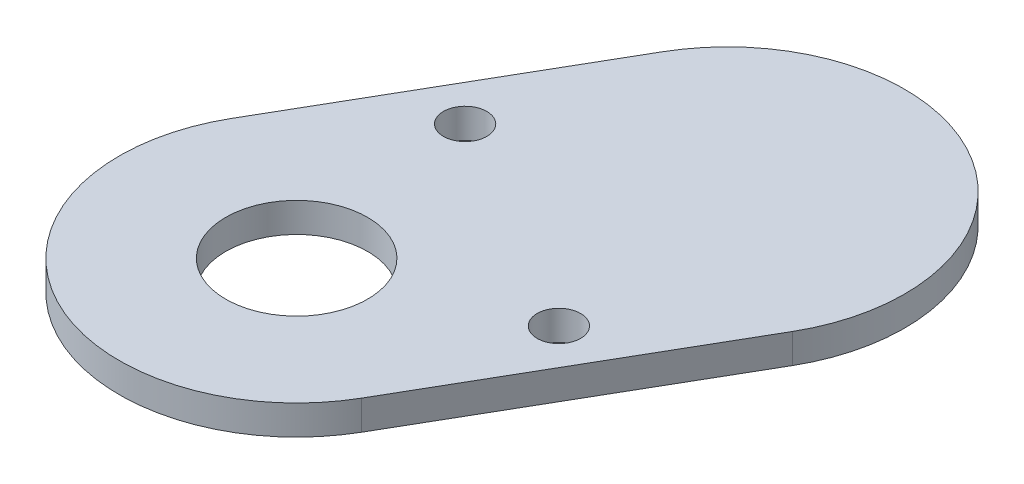
ISO-10303-21;
HEADER;
FILE_DESCRIPTION(('STEP AP214'),'2;1');
FILE_NAME('part.step','',(''),(''),'','','');
FILE_SCHEMA(('AUTOMOTIVE_DESIGN { 1 0 10303 214 1 1 1 1 }'));
ENDSEC;
DATA;
#1=APPLICATION_CONTEXT('core data for automotive mechanical design processes');
#2=APPLICATION_PROTOCOL_DEFINITION('international standard','automotive_design',2000,#1);
#3=PRODUCT_CONTEXT('',#1,'mechanical');
#4=PRODUCT('Part','Part','',(#3));
#5=PRODUCT_RELATED_PRODUCT_CATEGORY('part','',(#4));
#6=PRODUCT_DEFINITION_FORMATION('','',#4);
#7=PRODUCT_DEFINITION_CONTEXT('part definition',#1,'design');
#8=PRODUCT_DEFINITION('design','',#6,#7);
#9=PRODUCT_DEFINITION_SHAPE('','',#8);
#10=(LENGTH_UNIT() NAMED_UNIT(*) SI_UNIT(.MILLI.,.METRE.));
#11=(NAMED_UNIT(*) PLANE_ANGLE_UNIT() SI_UNIT($,.RADIAN.));
#12=(NAMED_UNIT(*) SI_UNIT($,.STERADIAN.) SOLID_ANGLE_UNIT());
#13=UNCERTAINTY_MEASURE_WITH_UNIT(LENGTH_MEASURE(1.E-05),#10,'distance_accuracy_value','');
#14=(GEOMETRIC_REPRESENTATION_CONTEXT(3) GLOBAL_UNCERTAINTY_ASSIGNED_CONTEXT((#13)) GLOBAL_UNIT_ASSIGNED_CONTEXT((#10,
#11,#12)) REPRESENTATION_CONTEXT('',''));
#15=CARTESIAN_POINT('',(0.,0.,0.));
#16=DIRECTION('',(0.,0.,1.));
#17=DIRECTION('',(1.,0.,0.));
#18=AXIS2_PLACEMENT_3D('',#15,#16,#17);
#19=CARTESIAN_POINT('',(-33.3708348754,54.1,-3.678203230276));
#20=DIRECTION('',(0.,1.,0.));
#21=DIRECTION('',(0.50000000000019,0.,-0.866025403784329));
#22=AXIS2_PLACEMENT_3D('',#19,#20,#21);
#23=CYLINDRICAL_SURFACE('',#22,1.1);
#24=CARTESIAN_POINT('',(-33.3708348754,54.,-3.678203230276));
#25=DIRECTION('',(0.,1.,0.));
#26=DIRECTION('',(0.50000000000019,0.,-0.866025403784329));
#27=AXIS2_PLACEMENT_3D('',#24,#25,#26);
#28=CIRCLE('',#27,1.1);
#29=CARTESIAN_POINT('',(-32.8208348754,54.,-4.630831174438));
#30=VERTEX_POINT('',#29);
#31=EDGE_CURVE('E156',#30,#30,#28,.T.);
#32=ORIENTED_EDGE('',*,*,#31,.T.);
#33=DIRECTION('',(0.,-1.,0.));
#34=VECTOR('',#33,1.);
#35=CARTESIAN_POINT('',(-32.8208348754,54.1,-4.630831174438));
#36=LINE('',#35,#34);
#37=CARTESIAN_POINT('',(-32.8208348754,52.5,-4.630831174438));
#38=VERTEX_POINT('',#37);
#39=EDGE_CURVE('E11',#30,#38,#36,.T.);
#40=ORIENTED_EDGE('',*,*,#39,.T.);
#41=CARTESIAN_POINT('',(-33.3708348754,52.5,-3.678203230276));
#42=DIRECTION('',(0.,1.,0.));
#43=DIRECTION('',(0.50000000000019,0.,-0.866025403784329));
#44=AXIS2_PLACEMENT_3D('',#41,#42,#43);
#45=CIRCLE('',#44,1.1);
#46=EDGE_CURVE('E144',#38,#38,#45,.T.);
#47=ORIENTED_EDGE('',*,*,#46,.F.);
#48=ORIENTED_EDGE('',*,*,#39,.F.);
#49=EDGE_LOOP('',(#32,#40,#47,#48));
#50=FACE_BOUND('',#49,.T.);
#51=ADVANCED_FACE('F16',(#50),#23,.F.);
#52=CARTESIAN_POINT('',(-44.62916512459,54.1,-10.17820323027));
#53=DIRECTION('',(0.,1.,0.));
#54=DIRECTION('',(0.50000000000019,0.,-0.866025403784329));
#55=AXIS2_PLACEMENT_3D('',#52,#53,#54);
#56=CYLINDRICAL_SURFACE('',#55,1.1);
#57=CARTESIAN_POINT('',(-44.62916512459,54.,-10.17820323027));
#58=DIRECTION('',(0.,1.,0.));
#59=DIRECTION('',(0.50000000000019,0.,-0.866025403784329));
#60=AXIS2_PLACEMENT_3D('',#57,#58,#59);
#61=CIRCLE('',#60,1.1);
#62=CARTESIAN_POINT('',(-44.07916512459,54.,-11.13083117443));
#63=VERTEX_POINT('',#62);
#64=EDGE_CURVE('E153',#63,#63,#61,.T.);
#65=ORIENTED_EDGE('',*,*,#64,.T.);
#66=DIRECTION('',(0.,-1.,0.));
#67=VECTOR('',#66,1.);
#68=CARTESIAN_POINT('',(-44.07916512459,54.1,-11.13083117443));
#69=LINE('',#68,#67);
#70=CARTESIAN_POINT('',(-44.07916512459,52.5,-11.13083117443));
#71=VERTEX_POINT('',#70);
#72=EDGE_CURVE('E24',#63,#71,#69,.T.);
#73=ORIENTED_EDGE('',*,*,#72,.T.);
#74=CARTESIAN_POINT('',(-44.62916512459,52.5,-10.17820323027));
#75=DIRECTION('',(0.,1.,0.));
#76=DIRECTION('',(0.50000000000019,0.,-0.866025403784329));
#77=AXIS2_PLACEMENT_3D('',#74,#75,#76);
#78=CIRCLE('',#77,1.1);
#79=EDGE_CURVE('E147',#71,#71,#78,.T.);
#80=ORIENTED_EDGE('',*,*,#79,.F.);
#81=ORIENTED_EDGE('',*,*,#72,.F.);
#82=EDGE_LOOP('',(#65,#73,#80,#81));
#83=FACE_BOUND('',#82,.T.);
#84=ADVANCED_FACE('F259',(#83),#56,.F.);
#85=CARTESIAN_POINT('',(-43.,54.1,0.));
#86=DIRECTION('',(0.,1.,0.));
#87=DIRECTION('',(0.50000000000019,0.,-0.866025403784329));
#88=AXIS2_PLACEMENT_3D('',#85,#86,#87);
#89=CYLINDRICAL_SURFACE('',#88,3.6);
#90=CARTESIAN_POINT('',(-43.,54.,0.));
#91=DIRECTION('',(0.,1.,0.));
#92=DIRECTION('',(0.50000000000019,0.,-0.866025403784329));
#93=AXIS2_PLACEMENT_3D('',#90,#91,#92);
#94=CIRCLE('',#93,3.6);
#95=CARTESIAN_POINT('',(-41.2,54.,-3.117691453624));
#96=VERTEX_POINT('',#95);
#97=EDGE_CURVE('E110',#96,#96,#94,.T.);
#98=ORIENTED_EDGE('',*,*,#97,.T.);
#99=DIRECTION('',(0.,-1.,0.));
#100=VECTOR('',#99,1.);
#101=CARTESIAN_POINT('',(-41.2,54.1,-3.117691453624));
#102=LINE('',#101,#100);
#103=CARTESIAN_POINT('',(-41.2,52.5,-3.117691453624));
#104=VERTEX_POINT('',#103);
#105=EDGE_CURVE('E142',#96,#104,#102,.T.);
#106=ORIENTED_EDGE('',*,*,#105,.T.);
#107=CARTESIAN_POINT('',(-43.,52.5,0.));
#108=DIRECTION('',(0.,1.,0.));
#109=DIRECTION('',(0.50000000000019,0.,-0.866025403784329));
#110=AXIS2_PLACEMENT_3D('',#107,#108,#109);
#111=CIRCLE('',#110,3.6);
#112=EDGE_CURVE('E148',#104,#104,#111,.T.);
#113=ORIENTED_EDGE('',*,*,#112,.F.);
#114=ORIENTED_EDGE('',*,*,#105,.F.);
#115=EDGE_LOOP('',(#98,#106,#113,#114));
#116=FACE_BOUND('',#115,.T.);
#117=ADVANCED_FACE('F263',(#116),#89,.F.);
#118=CARTESIAN_POINT('',(-27.20577136594,54.,-9.356406460551));
#119=DIRECTION('',(-0.866025403784329,0.,-0.50000000000019));
#120=DIRECTION('',(-0.50000000000019,0.,0.866025403784329));
#121=AXIS2_PLACEMENT_3D('',#118,#119,#120);
#122=PLANE('',#121);
#123=DIRECTION('',(-0.50000000000019,0.,0.866025403784329));
#124=VECTOR('',#123,1.);
#125=CARTESIAN_POINT('',(-27.20577136594,54.,-9.356406460551));
#126=LINE('',#125,#124);
#127=CARTESIAN_POINT('',(-27.20577136594,54.,-9.356406460551));
#128=VERTEX_POINT('',#127);
#129=CARTESIAN_POINT('',(-35.20577136594,54.,4.5));
#130=VERTEX_POINT('',#129);
#131=EDGE_CURVE('E92',#128,#130,#126,.T.);
#132=ORIENTED_EDGE('',*,*,#131,.T.);
#133=DIRECTION('',(0.,-1.,0.));
#134=VECTOR('',#133,1.);
#135=CARTESIAN_POINT('',(-35.20577136594,54.,4.5));
#136=LINE('',#135,#134);
#137=CARTESIAN_POINT('',(-35.20577136594,52.5,4.5));
#138=VERTEX_POINT('',#137);
#139=EDGE_CURVE('E128',#130,#138,#136,.T.);
#140=ORIENTED_EDGE('',*,*,#139,.T.);
#141=DIRECTION('',(-0.50000000000019,0.,0.866025403784329));
#142=VECTOR('',#141,1.);
#143=CARTESIAN_POINT('',(-27.20577136594,52.5,-9.356406460551));
#144=LINE('',#143,#142);
#145=CARTESIAN_POINT('',(-27.20577136594,52.5,-9.356406460551));
#146=VERTEX_POINT('',#145);
#147=EDGE_CURVE('E114',#146,#138,#144,.T.);
#148=ORIENTED_EDGE('',*,*,#147,.F.);
#149=DIRECTION('',(0.,-1.,0.));
#150=VECTOR('',#149,1.);
#151=CARTESIAN_POINT('',(-27.20577136594,54.,-9.356406460551));
#152=LINE('',#151,#150);
#153=EDGE_CURVE('E112',#128,#146,#152,.T.);
#154=ORIENTED_EDGE('',*,*,#153,.F.);
#155=EDGE_LOOP('',(#132,#140,#148,#154));
#156=FACE_BOUND('',#155,.T.);
#157=ADVANCED_FACE('F115',(#156),#122,.F.);
#158=CARTESIAN_POINT('',(-39.,52.5,-6.928203230276));
#159=DIRECTION('',(0.,-1.,0.));
#160=DIRECTION('',(0.,0.,-1.));
#161=AXIS2_PLACEMENT_3D('',#158,#159,#160);
#162=PLANE('',#161);
#163=ORIENTED_EDGE('',*,*,#46,.T.);
#164=EDGE_LOOP('',(#163));
#165=FACE_BOUND('',#164,.T.);
#166=ORIENTED_EDGE('',*,*,#79,.T.);
#167=EDGE_LOOP('',(#166));
#168=FACE_BOUND('',#167,.T.);
#169=ORIENTED_EDGE('',*,*,#112,.T.);
#170=EDGE_LOOP('',(#169));
#171=FACE_BOUND('',#170,.T.);
#172=DIRECTION('',(0.50000000000019,0.,-0.866025403784329));
#173=VECTOR('',#172,1.);
#174=CARTESIAN_POINT('',(-50.79422863406,52.5,-4.5));
#175=LINE('',#174,#173);
#176=CARTESIAN_POINT('',(-50.79422863406,52.5,-4.5));
#177=VERTEX_POINT('',#176);
#178=CARTESIAN_POINT('',(-42.79422863406,52.5,-18.35640646055));
#179=VERTEX_POINT('',#178);
#180=EDGE_CURVE('E135',#177,#179,#175,.T.);
#181=ORIENTED_EDGE('',*,*,#180,.T.);
#182=CARTESIAN_POINT('',(-35.,52.5,-13.85640646055));
#183=DIRECTION('',(0.,1.,0.));
#184=DIRECTION('',(0.866025403784329,0.,0.50000000000019));
#185=AXIS2_PLACEMENT_3D('',#182,#183,#184);
#186=CIRCLE('',#185,9.);
#187=EDGE_CURVE('E107',#146,#179,#186,.T.);
#188=ORIENTED_EDGE('',*,*,#187,.F.);
#189=ORIENTED_EDGE('',*,*,#147,.T.);
#190=CARTESIAN_POINT('',(-43.,52.5,0.));
#191=DIRECTION('',(0.,-1.,0.));
#192=DIRECTION('',(0.50000000000019,0.,-0.866025403784329));
#193=AXIS2_PLACEMENT_3D('',#190,#191,#192);
#194=CIRCLE('',#193,9.);
#195=EDGE_CURVE('E140',#138,#177,#194,.T.);
#196=ORIENTED_EDGE('',*,*,#195,.T.);
#197=EDGE_LOOP('',(#181,#188,#189,#196));
#198=FACE_BOUND('',#197,.T.);
#199=ADVANCED_FACE('F250',(#165,#168,#171,#198),#162,.T.);
#200=CARTESIAN_POINT('',(-39.,54.,-6.928203230276));
#201=DIRECTION('',(0.,-1.,0.));
#202=DIRECTION('',(0.,0.,-1.));
#203=AXIS2_PLACEMENT_3D('',#200,#201,#202);
#204=PLANE('',#203);
#205=ORIENTED_EDGE('',*,*,#31,.F.);
#206=EDGE_LOOP('',(#205));
#207=FACE_BOUND('',#206,.T.);
#208=ORIENTED_EDGE('',*,*,#64,.F.);
#209=EDGE_LOOP('',(#208));
#210=FACE_BOUND('',#209,.T.);
#211=ORIENTED_EDGE('',*,*,#97,.F.);
#212=EDGE_LOOP('',(#211));
#213=FACE_BOUND('',#212,.T.);
#214=CARTESIAN_POINT('',(-43.,54.,0.));
#215=DIRECTION('',(0.,-1.,0.));
#216=DIRECTION('',(0.50000000000019,0.,-0.866025403784329));
#217=AXIS2_PLACEMENT_3D('',#214,#215,#216);
#218=CIRCLE('',#217,9.);
#219=CARTESIAN_POINT('',(-50.79422863406,54.,-4.5));
#220=VERTEX_POINT('',#219);
#221=EDGE_CURVE('E105',#130,#220,#218,.T.);
#222=ORIENTED_EDGE('',*,*,#221,.F.);
#223=ORIENTED_EDGE('',*,*,#131,.F.);
#224=CARTESIAN_POINT('',(-35.,54.,-13.85640646055));
#225=DIRECTION('',(0.,-1.,0.));
#226=DIRECTION('',(-0.866025403784329,0.,-0.50000000000019));
#227=AXIS2_PLACEMENT_3D('',#224,#225,#226);
#228=CIRCLE('',#227,9.);
#229=CARTESIAN_POINT('',(-42.79422863406,54.,-18.35640646055));
#230=VERTEX_POINT('',#229);
#231=EDGE_CURVE('E99',#230,#128,#228,.T.);
#232=ORIENTED_EDGE('',*,*,#231,.F.);
#233=DIRECTION('',(0.50000000000019,0.,-0.866025403784329));
#234=VECTOR('',#233,1.);
#235=CARTESIAN_POINT('',(-50.79422863406,54.,-4.5));
#236=LINE('',#235,#234);
#237=EDGE_CURVE('E212',#220,#230,#236,.T.);
#238=ORIENTED_EDGE('',*,*,#237,.F.);
#239=EDGE_LOOP('',(#222,#223,#232,#238));
#240=FACE_BOUND('',#239,.T.);
#241=ADVANCED_FACE('F100',(#207,#210,#213,#240),#204,.F.);
#242=CARTESIAN_POINT('',(-35.,54.,-13.85640646055));
#243=DIRECTION('',(0.,1.,0.));
#244=DIRECTION('',(0.50000000000019,0.,-0.866025403784329));
#245=AXIS2_PLACEMENT_3D('',#242,#243,#244);
#246=CYLINDRICAL_SURFACE('',#245,9.);
#247=DIRECTION('',(0.,-1.,0.));
#248=VECTOR('',#247,1.);
#249=CARTESIAN_POINT('',(-42.79422863406,54.,-18.35640646055));
#250=LINE('',#249,#248);
#251=EDGE_CURVE('E120',#230,#179,#250,.T.);
#252=ORIENTED_EDGE('',*,*,#251,.F.);
#253=ORIENTED_EDGE('',*,*,#231,.T.);
#254=ORIENTED_EDGE('',*,*,#153,.T.);
#255=ORIENTED_EDGE('',*,*,#187,.T.);
#256=EDGE_LOOP('',(#252,#253,#254,#255));
#257=FACE_BOUND('',#256,.T.);
#258=ADVANCED_FACE('F119',(#257),#246,.T.);
#259=CARTESIAN_POINT('',(-43.,54.,0.));
#260=DIRECTION('',(0.,1.,0.));
#261=DIRECTION('',(0.50000000000019,0.,-0.866025403784329));
#262=AXIS2_PLACEMENT_3D('',#259,#260,#261);
#263=CYLINDRICAL_SURFACE('',#262,9.);
#264=DIRECTION('',(0.,-1.,0.));
#265=VECTOR('',#264,1.);
#266=CARTESIAN_POINT('',(-50.79422863406,54.,-4.5));
#267=LINE('',#266,#265);
#268=EDGE_CURVE('E136',#220,#177,#267,.T.);
#269=ORIENTED_EDGE('',*,*,#268,.T.);
#270=ORIENTED_EDGE('',*,*,#195,.F.);
#271=ORIENTED_EDGE('',*,*,#139,.F.);
#272=ORIENTED_EDGE('',*,*,#221,.T.);
#273=EDGE_LOOP('',(#269,#270,#271,#272));
#274=FACE_BOUND('',#273,.T.);
#275=ADVANCED_FACE('F248',(#274),#263,.T.);
#276=CARTESIAN_POINT('',(-50.79422863406,54.,-4.5));
#277=DIRECTION('',(0.866025403784329,0.,0.50000000000019));
#278=DIRECTION('',(0.,-1.,0.));
#279=AXIS2_PLACEMENT_3D('',#276,#277,#278);
#280=PLANE('',#279);
#281=ORIENTED_EDGE('',*,*,#237,.T.);
#282=ORIENTED_EDGE('',*,*,#251,.T.);
#283=ORIENTED_EDGE('',*,*,#180,.F.);
#284=ORIENTED_EDGE('',*,*,#268,.F.);
#285=EDGE_LOOP('',(#281,#282,#283,#284));
#286=FACE_BOUND('',#285,.T.);
#287=ADVANCED_FACE('F243',(#286),#280,.F.);
#288=CLOSED_SHELL('',(#51,#84,#117,#157,#199,#241,#258,#275,#287));
#289=MANIFOLD_SOLID_BREP('B1',#288);
#290=ADVANCED_BREP_SHAPE_REPRESENTATION('',(#18,#289),#14);
#291=SHAPE_DEFINITION_REPRESENTATION(#9,#290);
ENDSEC;
END-ISO-10303-21;
